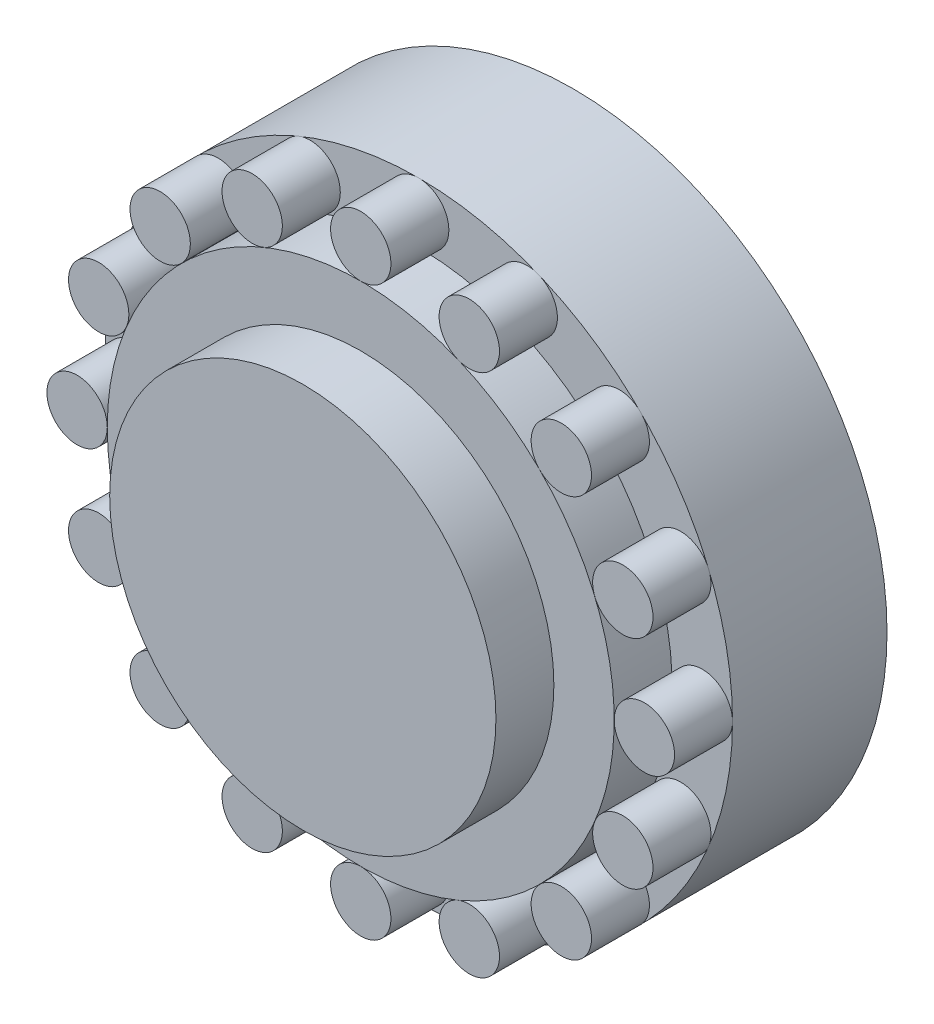
ISO-10303-21;
HEADER;
FILE_DESCRIPTION(('STEP AP214'),'2;1');
FILE_NAME('part.step','',(''),(''),'','','');
FILE_SCHEMA(('AUTOMOTIVE_DESIGN { 1 0 10303 214 1 1 1 1 }'));
ENDSEC;
DATA;
#1=APPLICATION_CONTEXT('core data for automotive mechanical design processes');
#2=APPLICATION_PROTOCOL_DEFINITION('international standard','automotive_design',2000,#1);
#3=PRODUCT_CONTEXT('',#1,'mechanical');
#4=PRODUCT('Part','Part','',(#3));
#5=PRODUCT_RELATED_PRODUCT_CATEGORY('part','',(#4));
#6=PRODUCT_DEFINITION_FORMATION('','',#4);
#7=PRODUCT_DEFINITION_CONTEXT('part definition',#1,'design');
#8=PRODUCT_DEFINITION('design','',#6,#7);
#9=PRODUCT_DEFINITION_SHAPE('','',#8);
#10=(LENGTH_UNIT() NAMED_UNIT(*) SI_UNIT(.MILLI.,.METRE.));
#11=(NAMED_UNIT(*) PLANE_ANGLE_UNIT() SI_UNIT($,.RADIAN.));
#12=(NAMED_UNIT(*) SI_UNIT($,.STERADIAN.) SOLID_ANGLE_UNIT());
#13=UNCERTAINTY_MEASURE_WITH_UNIT(LENGTH_MEASURE(1.E-05),#10,'distance_accuracy_value','');
#14=(GEOMETRIC_REPRESENTATION_CONTEXT(3) GLOBAL_UNCERTAINTY_ASSIGNED_CONTEXT((#13)) GLOBAL_UNIT_ASSIGNED_CONTEXT((#10,
#11,#12)) REPRESENTATION_CONTEXT('',''));
#15=CARTESIAN_POINT('',(0.,0.,0.));
#16=DIRECTION('',(0.,0.,1.));
#17=DIRECTION('',(1.,0.,0.));
#18=AXIS2_PLACEMENT_3D('',#15,#16,#17);
#19=CARTESIAN_POINT('',(-27.1389612677034,-11.2412217614125,22.));
#20=DIRECTION('',(0.,0.,-1.));
#21=DIRECTION('',(-1.,0.,0.));
#22=AXIS2_PLACEMENT_3D('',#19,#20,#21);
#23=CYLINDRICAL_SURFACE('',#22,3.125);
#24=CARTESIAN_POINT('',(-27.1389612677034,-11.2412217614125,22.));
#25=DIRECTION('',(0.,0.,1.));
#26=DIRECTION('',(1.,0.,0.));
#27=AXIS2_PLACEMENT_3D('',#24,#25,#26);
#28=CIRCLE('',#27,3.125);
#29=CARTESIAN_POINT('',(-24.0139612677034,-11.2412217614125,22.));
#30=VERTEX_POINT('',#29);
#31=EDGE_CURVE('E11',#30,#30,#28,.T.);
#32=ORIENTED_EDGE('',*,*,#31,.F.);
#33=EDGE_LOOP('',(#32));
#34=FACE_BOUND('',#33,.T.);
#35=CARTESIAN_POINT('',(-27.1389612677034,-11.2412217614125,16.));
#36=DIRECTION('',(0.,0.,1.));
#37=DIRECTION('',(1.,0.,0.));
#38=AXIS2_PLACEMENT_3D('',#35,#36,#37);
#39=CIRCLE('',#38,3.125);
#40=CARTESIAN_POINT('',(-24.0139612677034,-11.2412217614125,16.));
#41=VERTEX_POINT('',#40);
#42=EDGE_CURVE('E44',#41,#41,#39,.T.);
#43=ORIENTED_EDGE('',*,*,#42,.T.);
#44=EDGE_LOOP('',(#43));
#45=FACE_BOUND('',#44,.T.);
#46=ADVANCED_FACE('F41',(#34,#45),#23,.T.);
#47=CARTESIAN_POINT('',(-27.1389612677034,-11.2412217614125,22.));
#48=DIRECTION('',(0.,0.,1.));
#49=DIRECTION('',(1.,0.,0.));
#50=AXIS2_PLACEMENT_3D('',#47,#48,#49);
#51=PLANE('',#50);
#52=ORIENTED_EDGE('',*,*,#31,.T.);
#53=EDGE_LOOP('',(#52));
#54=FACE_BOUND('',#53,.T.);
#55=ADVANCED_FACE('F56',(#54),#51,.T.);
#56=CARTESIAN_POINT('',(-27.1389612677034,-11.2412217614125,16.));
#57=DIRECTION('',(0.,0.,1.));
#58=DIRECTION('',(1.,0.,0.));
#59=AXIS2_PLACEMENT_3D('',#56,#57,#58);
#60=PLANE('',#59);
#61=ORIENTED_EDGE('',*,*,#42,.F.);
#62=EDGE_LOOP('',(#61));
#63=FACE_BOUND('',#62,.T.);
#64=ADVANCED_FACE('F54',(#63),#60,.F.);
#65=CLOSED_SHELL('',(#46,#55,#64));
#66=MANIFOLD_SOLID_BREP('B2',#65);
#67=CARTESIAN_POINT('',(-20.7713015213976,-20.7710614902253,22.));
#68=DIRECTION('',(0.,0.,-1.));
#69=DIRECTION('',(-1.,0.,0.));
#70=AXIS2_PLACEMENT_3D('',#67,#68,#69);
#71=CYLINDRICAL_SURFACE('',#70,3.125);
#72=CARTESIAN_POINT('',(-20.7713015213976,-20.7710614902253,22.));
#73=DIRECTION('',(0.,0.,1.));
#74=DIRECTION('',(1.,0.,0.));
#75=AXIS2_PLACEMENT_3D('',#72,#73,#74);
#76=CIRCLE('',#75,3.125);
#77=CARTESIAN_POINT('',(-17.6463015213976,-20.7710614902253,22.));
#78=VERTEX_POINT('',#77);
#79=EDGE_CURVE('E40',#78,#78,#76,.T.);
#80=ORIENTED_EDGE('',*,*,#79,.F.);
#81=EDGE_LOOP('',(#80));
#82=FACE_BOUND('',#81,.T.);
#83=CARTESIAN_POINT('',(-20.7713015213976,-20.7710614902253,16.));
#84=DIRECTION('',(0.,0.,1.));
#85=DIRECTION('',(1.,0.,0.));
#86=AXIS2_PLACEMENT_3D('',#83,#84,#85);
#87=CIRCLE('',#86,3.125);
#88=CARTESIAN_POINT('',(-17.6463015213976,-20.7710614902253,16.));
#89=VERTEX_POINT('',#88);
#90=EDGE_CURVE('E92',#89,#89,#87,.T.);
#91=ORIENTED_EDGE('',*,*,#90,.T.);
#92=EDGE_LOOP('',(#91));
#93=FACE_BOUND('',#92,.T.);
#94=ADVANCED_FACE('F89',(#82,#93),#71,.T.);
#95=CARTESIAN_POINT('',(-20.7713015213976,-20.7710614902253,22.));
#96=DIRECTION('',(0.,0.,1.));
#97=DIRECTION('',(1.,0.,0.));
#98=AXIS2_PLACEMENT_3D('',#95,#96,#97);
#99=PLANE('',#98);
#100=ORIENTED_EDGE('',*,*,#79,.T.);
#101=EDGE_LOOP('',(#100));
#102=FACE_BOUND('',#101,.T.);
#103=ADVANCED_FACE('F104',(#102),#99,.T.);
#104=CARTESIAN_POINT('',(-20.7713015213976,-20.7710614902253,16.));
#105=DIRECTION('',(0.,0.,1.));
#106=DIRECTION('',(1.,0.,0.));
#107=AXIS2_PLACEMENT_3D('',#104,#105,#106);
#108=PLANE('',#107);
#109=ORIENTED_EDGE('',*,*,#90,.F.);
#110=EDGE_LOOP('',(#109));
#111=FACE_BOUND('',#110,.T.);
#112=ADVANCED_FACE('F102',(#111),#108,.F.);
#113=CLOSED_SHELL('',(#94,#103,#112));
#114=MANIFOLD_SOLID_BREP('B6',#113);
#115=CARTESIAN_POINT('',(-11.2414392344783,-27.1386874759392,22.));
#116=DIRECTION('',(0.,0.,-1.));
#117=DIRECTION('',(-1.,0.,0.));
#118=AXIS2_PLACEMENT_3D('',#115,#116,#117);
#119=CYLINDRICAL_SURFACE('',#118,3.125);
#120=CARTESIAN_POINT('',(-11.2414392344783,-27.1386874759392,22.));
#121=DIRECTION('',(0.,0.,1.));
#122=DIRECTION('',(1.,0.,0.));
#123=AXIS2_PLACEMENT_3D('',#120,#121,#122);
#124=CIRCLE('',#123,3.125);
#125=CARTESIAN_POINT('',(-8.11643923447834,-27.1386874759392,22.));
#126=VERTEX_POINT('',#125);
#127=EDGE_CURVE('E88',#126,#126,#124,.T.);
#128=ORIENTED_EDGE('',*,*,#127,.F.);
#129=EDGE_LOOP('',(#128));
#130=FACE_BOUND('',#129,.T.);
#131=CARTESIAN_POINT('',(-11.2414392344783,-27.1386874759392,16.));
#132=DIRECTION('',(0.,0.,1.));
#133=DIRECTION('',(1.,0.,0.));
#134=AXIS2_PLACEMENT_3D('',#131,#132,#133);
#135=CIRCLE('',#134,3.125);
#136=CARTESIAN_POINT('',(-8.11643923447834,-27.1386874759392,16.));
#137=VERTEX_POINT('',#136);
#138=EDGE_CURVE('E140',#137,#137,#135,.T.);
#139=ORIENTED_EDGE('',*,*,#138,.T.);
#140=EDGE_LOOP('',(#139));
#141=FACE_BOUND('',#140,.T.);
#142=ADVANCED_FACE('F137',(#130,#141),#119,.T.);
#143=CARTESIAN_POINT('',(-11.2414392344783,-27.1386874759392,22.));
#144=DIRECTION('',(0.,0.,1.));
#145=DIRECTION('',(1.,0.,0.));
#146=AXIS2_PLACEMENT_3D('',#143,#144,#145);
#147=PLANE('',#146);
#148=ORIENTED_EDGE('',*,*,#127,.T.);
#149=EDGE_LOOP('',(#148));
#150=FACE_BOUND('',#149,.T.);
#151=ADVANCED_FACE('F152',(#150),#147,.T.);
#152=CARTESIAN_POINT('',(-11.2414392344783,-27.1386874759392,16.));
#153=DIRECTION('',(0.,0.,1.));
#154=DIRECTION('',(1.,0.,0.));
#155=AXIS2_PLACEMENT_3D('',#152,#153,#154);
#156=PLANE('',#155);
#157=ORIENTED_EDGE('',*,*,#138,.F.);
#158=EDGE_LOOP('',(#157));
#159=FACE_BOUND('',#158,.T.);
#160=ADVANCED_FACE('F150',(#159),#156,.F.);
#161=CLOSED_SHELL('',(#142,#151,#160));
#162=MANIFOLD_SOLID_BREP('B35',#161);
#163=CARTESIAN_POINT('',(-0.000209551712327896,-29.3746863849023,22.));
#164=DIRECTION('',(0.,0.,-1.));
#165=DIRECTION('',(-1.,0.,0.));
#166=AXIS2_PLACEMENT_3D('',#163,#164,#165);
#167=CYLINDRICAL_SURFACE('',#166,3.125);
#168=CARTESIAN_POINT('',(-0.000209551712327896,-29.3746863849023,22.));
#169=DIRECTION('',(0.,0.,1.));
#170=DIRECTION('',(1.,0.,0.));
#171=AXIS2_PLACEMENT_3D('',#168,#169,#170);
#172=CIRCLE('',#171,3.125);
#173=CARTESIAN_POINT('',(3.12479044828767,-29.3746863849023,22.));
#174=VERTEX_POINT('',#173);
#175=EDGE_CURVE('E136',#174,#174,#172,.T.);
#176=ORIENTED_EDGE('',*,*,#175,.F.);
#177=EDGE_LOOP('',(#176));
#178=FACE_BOUND('',#177,.T.);
#179=CARTESIAN_POINT('',(-0.000209551712327896,-29.3746863849023,16.));
#180=DIRECTION('',(0.,0.,1.));
#181=DIRECTION('',(1.,0.,0.));
#182=AXIS2_PLACEMENT_3D('',#179,#180,#181);
#183=CIRCLE('',#182,3.125);
#184=CARTESIAN_POINT('',(3.12479044828767,-29.3746863849023,16.));
#185=VERTEX_POINT('',#184);
#186=EDGE_CURVE('E188',#185,#185,#183,.T.);
#187=ORIENTED_EDGE('',*,*,#186,.T.);
#188=EDGE_LOOP('',(#187));
#189=FACE_BOUND('',#188,.T.);
#190=ADVANCED_FACE('F185',(#178,#189),#167,.T.);
#191=CARTESIAN_POINT('',(-0.000209551712327896,-29.3746863849023,22.));
#192=DIRECTION('',(0.,0.,1.));
#193=DIRECTION('',(1.,0.,0.));
#194=AXIS2_PLACEMENT_3D('',#191,#192,#193);
#195=PLANE('',#194);
#196=ORIENTED_EDGE('',*,*,#175,.T.);
#197=EDGE_LOOP('',(#196));
#198=FACE_BOUND('',#197,.T.);
#199=ADVANCED_FACE('F200',(#198),#195,.T.);
#200=CARTESIAN_POINT('',(-0.000209551712327896,-29.3746863849023,16.));
#201=DIRECTION('',(0.,0.,1.));
#202=DIRECTION('',(1.,0.,0.));
#203=AXIS2_PLACEMENT_3D('',#200,#201,#202);
#204=PLANE('',#203);
#205=ORIENTED_EDGE('',*,*,#186,.F.);
#206=EDGE_LOOP('',(#205));
#207=FACE_BOUND('',#206,.T.);
#208=ADVANCED_FACE('F198',(#207),#204,.F.);
#209=CLOSED_SHELL('',(#190,#199,#208));
#210=MANIFOLD_SOLID_BREP('B83',#209);
#211=CARTESIAN_POINT('',(11.2410122097001,-27.1386476526057,22.));
#212=DIRECTION('',(0.,0.,-1.));
#213=DIRECTION('',(-1.,0.,0.));
#214=AXIS2_PLACEMENT_3D('',#211,#212,#213);
#215=CYLINDRICAL_SURFACE('',#214,3.125);
#216=CARTESIAN_POINT('',(11.2410122097001,-27.1386476526057,22.));
#217=DIRECTION('',(0.,0.,1.));
#218=DIRECTION('',(1.,0.,0.));
#219=AXIS2_PLACEMENT_3D('',#216,#217,#218);
#220=CIRCLE('',#219,3.125);
#221=CARTESIAN_POINT('',(14.3660122097001,-27.1386476526057,22.));
#222=VERTEX_POINT('',#221);
#223=EDGE_CURVE('E184',#222,#222,#220,.T.);
#224=ORIENTED_EDGE('',*,*,#223,.F.);
#225=EDGE_LOOP('',(#224));
#226=FACE_BOUND('',#225,.T.);
#227=CARTESIAN_POINT('',(11.2410122097001,-27.1386476526057,16.));
#228=DIRECTION('',(0.,0.,1.));
#229=DIRECTION('',(1.,0.,0.));
#230=AXIS2_PLACEMENT_3D('',#227,#228,#229);
#231=CIRCLE('',#230,3.125);
#232=CARTESIAN_POINT('',(14.3660122097001,-27.1386476526057,16.));
#233=VERTEX_POINT('',#232);
#234=EDGE_CURVE('E236',#233,#233,#231,.T.);
#235=ORIENTED_EDGE('',*,*,#234,.T.);
#236=EDGE_LOOP('',(#235));
#237=FACE_BOUND('',#236,.T.);
#238=ADVANCED_FACE('F233',(#226,#237),#215,.T.);
#239=CARTESIAN_POINT('',(11.2410122097001,-27.1386476526057,22.));
#240=DIRECTION('',(0.,0.,1.));
#241=DIRECTION('',(1.,0.,0.));
#242=AXIS2_PLACEMENT_3D('',#239,#240,#241);
#243=PLANE('',#242);
#244=ORIENTED_EDGE('',*,*,#223,.T.);
#245=EDGE_LOOP('',(#244));
#246=FACE_BOUND('',#245,.T.);
#247=ADVANCED_FACE('F248',(#246),#243,.T.);
#248=CARTESIAN_POINT('',(11.2410122097001,-27.1386476526057,16.));
#249=DIRECTION('',(0.,0.,1.));
#250=DIRECTION('',(1.,0.,0.));
#251=AXIS2_PLACEMENT_3D('',#248,#249,#250);
#252=PLANE('',#251);
#253=ORIENTED_EDGE('',*,*,#234,.F.);
#254=EDGE_LOOP('',(#253));
#255=FACE_BOUND('',#254,.T.);
#256=ADVANCED_FACE('F246',(#255),#252,.F.);
#257=CLOSED_SHELL('',(#238,#247,#256));
#258=MANIFOLD_SOLID_BREP('B131',#257);
#259=CARTESIAN_POINT('',(20.770851938513,-20.7709879062999,22.));
#260=DIRECTION('',(0.,0.,-1.));
#261=DIRECTION('',(-1.,0.,0.));
#262=AXIS2_PLACEMENT_3D('',#259,#260,#261);
#263=CYLINDRICAL_SURFACE('',#262,3.125);
#264=CARTESIAN_POINT('',(20.770851938513,-20.7709879062999,22.));
#265=DIRECTION('',(0.,0.,1.));
#266=DIRECTION('',(1.,0.,0.));
#267=AXIS2_PLACEMENT_3D('',#264,#265,#266);
#268=CIRCLE('',#267,3.125);
#269=CARTESIAN_POINT('',(23.895851938513,-20.7709879062999,22.));
#270=VERTEX_POINT('',#269);
#271=EDGE_CURVE('E232',#270,#270,#268,.T.);
#272=ORIENTED_EDGE('',*,*,#271,.F.);
#273=EDGE_LOOP('',(#272));
#274=FACE_BOUND('',#273,.T.);
#275=CARTESIAN_POINT('',(20.770851938513,-20.7709879062999,16.));
#276=DIRECTION('',(0.,0.,1.));
#277=DIRECTION('',(1.,0.,0.));
#278=AXIS2_PLACEMENT_3D('',#275,#276,#277);
#279=CIRCLE('',#278,3.125);
#280=CARTESIAN_POINT('',(23.895851938513,-20.7709879062999,16.));
#281=VERTEX_POINT('',#280);
#282=EDGE_CURVE('E284',#281,#281,#279,.T.);
#283=ORIENTED_EDGE('',*,*,#282,.T.);
#284=EDGE_LOOP('',(#283));
#285=FACE_BOUND('',#284,.T.);
#286=ADVANCED_FACE('F281',(#274,#285),#263,.T.);
#287=CARTESIAN_POINT('',(20.770851938513,-20.7709879062999,22.));
#288=DIRECTION('',(0.,0.,1.));
#289=DIRECTION('',(1.,0.,0.));
#290=AXIS2_PLACEMENT_3D('',#287,#288,#289);
#291=PLANE('',#290);
#292=ORIENTED_EDGE('',*,*,#271,.T.);
#293=EDGE_LOOP('',(#292));
#294=FACE_BOUND('',#293,.T.);
#295=ADVANCED_FACE('F296',(#294),#291,.T.);
#296=CARTESIAN_POINT('',(20.770851938513,-20.7709879062999,16.));
#297=DIRECTION('',(0.,0.,1.));
#298=DIRECTION('',(1.,0.,0.));
#299=AXIS2_PLACEMENT_3D('',#296,#297,#298);
#300=PLANE('',#299);
#301=ORIENTED_EDGE('',*,*,#282,.F.);
#302=EDGE_LOOP('',(#301));
#303=FACE_BOUND('',#302,.T.);
#304=ADVANCED_FACE('F294',(#303),#300,.F.);
#305=CLOSED_SHELL('',(#286,#295,#304));
#306=MANIFOLD_SOLID_BREP('B179',#305);
#307=CARTESIAN_POINT('',(27.1384779242268,-11.2411256193806,22.));
#308=DIRECTION('',(0.,0.,-1.));
#309=DIRECTION('',(-1.,0.,0.));
#310=AXIS2_PLACEMENT_3D('',#307,#308,#309);
#311=CYLINDRICAL_SURFACE('',#310,3.125);
#312=CARTESIAN_POINT('',(27.1384779242268,-11.2411256193806,22.));
#313=DIRECTION('',(0.,0.,1.));
#314=DIRECTION('',(1.,0.,0.));
#315=AXIS2_PLACEMENT_3D('',#312,#313,#314);
#316=CIRCLE('',#315,3.125);
#317=CARTESIAN_POINT('',(30.2634779242268,-11.2411256193806,22.));
#318=VERTEX_POINT('',#317);
#319=EDGE_CURVE('E280',#318,#318,#316,.T.);
#320=ORIENTED_EDGE('',*,*,#319,.F.);
#321=EDGE_LOOP('',(#320));
#322=FACE_BOUND('',#321,.T.);
#323=CARTESIAN_POINT('',(27.1384779242268,-11.2411256193806,16.));
#324=DIRECTION('',(0.,0.,1.));
#325=DIRECTION('',(1.,0.,0.));
#326=AXIS2_PLACEMENT_3D('',#323,#324,#325);
#327=CIRCLE('',#326,3.125);
#328=CARTESIAN_POINT('',(30.2634779242268,-11.2411256193806,16.));
#329=VERTEX_POINT('',#328);
#330=EDGE_CURVE('E332',#329,#329,#327,.T.);
#331=ORIENTED_EDGE('',*,*,#330,.T.);
#332=EDGE_LOOP('',(#331));
#333=FACE_BOUND('',#332,.T.);
#334=ADVANCED_FACE('F329',(#322,#333),#311,.T.);
#335=CARTESIAN_POINT('',(27.1384779242268,-11.2411256193806,22.));
#336=DIRECTION('',(0.,0.,1.));
#337=DIRECTION('',(1.,0.,0.));
#338=AXIS2_PLACEMENT_3D('',#335,#336,#337);
#339=PLANE('',#338);
#340=ORIENTED_EDGE('',*,*,#319,.T.);
#341=EDGE_LOOP('',(#340));
#342=FACE_BOUND('',#341,.T.);
#343=ADVANCED_FACE('F344',(#342),#339,.T.);
#344=CARTESIAN_POINT('',(27.1384779242268,-11.2411256193806,16.));
#345=DIRECTION('',(0.,0.,1.));
#346=DIRECTION('',(1.,0.,0.));
#347=AXIS2_PLACEMENT_3D('',#344,#345,#346);
#348=PLANE('',#347);
#349=ORIENTED_EDGE('',*,*,#330,.F.);
#350=EDGE_LOOP('',(#349));
#351=FACE_BOUND('',#350,.T.);
#352=ADVANCED_FACE('F342',(#351),#348,.F.);
#353=CLOSED_SHELL('',(#334,#343,#352));
#354=MANIFOLD_SOLID_BREP('B227',#353);
#355=CARTESIAN_POINT('',(29.37447683319,0.000104063385373612,22.));
#356=DIRECTION('',(0.,0.,-1.));
#357=DIRECTION('',(-1.,0.,0.));
#358=AXIS2_PLACEMENT_3D('',#355,#356,#357);
#359=CYLINDRICAL_SURFACE('',#358,3.12499999999999);
#360=CARTESIAN_POINT('',(29.37447683319,0.000104063385373612,22.));
#361=DIRECTION('',(0.,0.,1.));
#362=DIRECTION('',(1.,0.,0.));
#363=AXIS2_PLACEMENT_3D('',#360,#361,#362);
#364=CIRCLE('',#363,3.12499999999999);
#365=CARTESIAN_POINT('',(32.49947683319,0.000104063385373612,22.));
#366=VERTEX_POINT('',#365);
#367=EDGE_CURVE('E328',#366,#366,#364,.T.);
#368=ORIENTED_EDGE('',*,*,#367,.F.);
#369=EDGE_LOOP('',(#368));
#370=FACE_BOUND('',#369,.T.);
#371=CARTESIAN_POINT('',(29.37447683319,0.000104063385373612,16.));
#372=DIRECTION('',(0.,0.,1.));
#373=DIRECTION('',(1.,0.,0.));
#374=AXIS2_PLACEMENT_3D('',#371,#372,#373);
#375=CIRCLE('',#374,3.12499999999999);
#376=CARTESIAN_POINT('',(32.49947683319,0.000104063385373612,16.));
#377=VERTEX_POINT('',#376);
#378=EDGE_CURVE('E380',#377,#377,#375,.T.);
#379=ORIENTED_EDGE('',*,*,#378,.T.);
#380=EDGE_LOOP('',(#379));
#381=FACE_BOUND('',#380,.T.);
#382=ADVANCED_FACE('F377',(#370,#381),#359,.T.);
#383=CARTESIAN_POINT('',(29.37447683319,0.000104063385373612,22.));
#384=DIRECTION('',(0.,0.,1.));
#385=DIRECTION('',(1.,0.,0.));
#386=AXIS2_PLACEMENT_3D('',#383,#384,#385);
#387=PLANE('',#386);
#388=ORIENTED_EDGE('',*,*,#367,.T.);
#389=EDGE_LOOP('',(#388));
#390=FACE_BOUND('',#389,.T.);
#391=ADVANCED_FACE('F392',(#390),#387,.T.);
#392=CARTESIAN_POINT('',(29.37447683319,0.000104063385373612,16.));
#393=DIRECTION('',(0.,0.,1.));
#394=DIRECTION('',(1.,0.,0.));
#395=AXIS2_PLACEMENT_3D('',#392,#393,#394);
#396=PLANE('',#395);
#397=ORIENTED_EDGE('',*,*,#378,.F.);
#398=EDGE_LOOP('',(#397));
#399=FACE_BOUND('',#398,.T.);
#400=ADVANCED_FACE('F390',(#399),#396,.F.);
#401=CLOSED_SHELL('',(#382,#391,#400));
#402=MANIFOLD_SOLID_BREP('B275',#401);
#403=CARTESIAN_POINT('',(27.1384381008933,11.2413258247978,22.));
#404=DIRECTION('',(0.,0.,-1.));
#405=DIRECTION('',(-1.,0.,0.));
#406=AXIS2_PLACEMENT_3D('',#403,#404,#405);
#407=CYLINDRICAL_SURFACE('',#406,3.125);
#408=CARTESIAN_POINT('',(27.1384381008933,11.2413258247978,22.));
#409=DIRECTION('',(0.,0.,1.));
#410=DIRECTION('',(1.,0.,0.));
#411=AXIS2_PLACEMENT_3D('',#408,#409,#410);
#412=CIRCLE('',#411,3.125);
#413=CARTESIAN_POINT('',(30.2634381008933,11.2413258247978,22.));
#414=VERTEX_POINT('',#413);
#415=EDGE_CURVE('E376',#414,#414,#412,.T.);
#416=ORIENTED_EDGE('',*,*,#415,.F.);
#417=EDGE_LOOP('',(#416));
#418=FACE_BOUND('',#417,.T.);
#419=CARTESIAN_POINT('',(27.1384381008933,11.2413258247978,16.));
#420=DIRECTION('',(0.,0.,1.));
#421=DIRECTION('',(1.,0.,0.));
#422=AXIS2_PLACEMENT_3D('',#419,#420,#421);
#423=CIRCLE('',#422,3.125);
#424=CARTESIAN_POINT('',(30.2634381008933,11.2413258247978,16.));
#425=VERTEX_POINT('',#424);
#426=EDGE_CURVE('E428',#425,#425,#423,.T.);
#427=ORIENTED_EDGE('',*,*,#426,.T.);
#428=EDGE_LOOP('',(#427));
#429=FACE_BOUND('',#428,.T.);
#430=ADVANCED_FACE('F425',(#418,#429),#407,.T.);
#431=CARTESIAN_POINT('',(27.1384381008933,11.2413258247978,22.));
#432=DIRECTION('',(0.,0.,1.));
#433=DIRECTION('',(1.,0.,0.));
#434=AXIS2_PLACEMENT_3D('',#431,#432,#433);
#435=PLANE('',#434);
#436=ORIENTED_EDGE('',*,*,#415,.T.);
#437=EDGE_LOOP('',(#436));
#438=FACE_BOUND('',#437,.T.);
#439=ADVANCED_FACE('F440',(#438),#435,.T.);
#440=CARTESIAN_POINT('',(27.1384381008933,11.2413258247978,16.));
#441=DIRECTION('',(0.,0.,1.));
#442=DIRECTION('',(1.,0.,0.));
#443=AXIS2_PLACEMENT_3D('',#440,#441,#442);
#444=PLANE('',#443);
#445=ORIENTED_EDGE('',*,*,#426,.F.);
#446=EDGE_LOOP('',(#445));
#447=FACE_BOUND('',#446,.T.);
#448=ADVANCED_FACE('F438',(#447),#444,.F.);
#449=CLOSED_SHELL('',(#430,#439,#448));
#450=MANIFOLD_SOLID_BREP('B323',#449);
#451=CARTESIAN_POINT('',(20.7707783545875,20.7711655536107,22.));
#452=DIRECTION('',(0.,0.,-1.));
#453=DIRECTION('',(-1.,0.,0.));
#454=AXIS2_PLACEMENT_3D('',#451,#452,#453);
#455=CYLINDRICAL_SURFACE('',#454,3.125);
#456=CARTESIAN_POINT('',(20.7707783545875,20.7711655536107,22.));
#457=DIRECTION('',(0.,0.,1.));
#458=DIRECTION('',(1.,0.,0.));
#459=AXIS2_PLACEMENT_3D('',#456,#457,#458);
#460=CIRCLE('',#459,3.125);
#461=CARTESIAN_POINT('',(23.8957783545875,20.7711655536107,22.));
#462=VERTEX_POINT('',#461);
#463=EDGE_CURVE('E424',#462,#462,#460,.T.);
#464=ORIENTED_EDGE('',*,*,#463,.F.);
#465=EDGE_LOOP('',(#464));
#466=FACE_BOUND('',#465,.T.);
#467=CARTESIAN_POINT('',(20.7707783545875,20.7711655536107,16.));
#468=DIRECTION('',(0.,0.,1.));
#469=DIRECTION('',(1.,0.,0.));
#470=AXIS2_PLACEMENT_3D('',#467,#468,#469);
#471=CIRCLE('',#470,3.125);
#472=CARTESIAN_POINT('',(23.8957783545875,20.7711655536107,16.));
#473=VERTEX_POINT('',#472);
#474=EDGE_CURVE('E476',#473,#473,#471,.T.);
#475=ORIENTED_EDGE('',*,*,#474,.T.);
#476=EDGE_LOOP('',(#475));
#477=FACE_BOUND('',#476,.T.);
#478=ADVANCED_FACE('F473',(#466,#477),#455,.T.);
#479=CARTESIAN_POINT('',(20.7707783545875,20.7711655536107,22.));
#480=DIRECTION('',(0.,0.,1.));
#481=DIRECTION('',(1.,0.,0.));
#482=AXIS2_PLACEMENT_3D('',#479,#480,#481);
#483=PLANE('',#482);
#484=ORIENTED_EDGE('',*,*,#463,.T.);
#485=EDGE_LOOP('',(#484));
#486=FACE_BOUND('',#485,.T.);
#487=ADVANCED_FACE('F488',(#486),#483,.T.);
#488=CARTESIAN_POINT('',(20.7707783545875,20.7711655536107,16.));
#489=DIRECTION('',(0.,0.,1.));
#490=DIRECTION('',(1.,0.,0.));
#491=AXIS2_PLACEMENT_3D('',#488,#489,#490);
#492=PLANE('',#491);
#493=ORIENTED_EDGE('',*,*,#474,.F.);
#494=EDGE_LOOP('',(#493));
#495=FACE_BOUND('',#494,.T.);
#496=ADVANCED_FACE('F486',(#495),#492,.F.);
#497=CLOSED_SHELL('',(#478,#487,#496));
#498=MANIFOLD_SOLID_BREP('B371',#497);
#499=CARTESIAN_POINT('',(11.2409160676683,27.1387915393245,22.));
#500=DIRECTION('',(0.,0.,-1.));
#501=DIRECTION('',(-1.,0.,0.));
#502=AXIS2_PLACEMENT_3D('',#499,#500,#501);
#503=CYLINDRICAL_SURFACE('',#502,3.125);
#504=CARTESIAN_POINT('',(11.2409160676683,27.1387915393245,22.));
#505=DIRECTION('',(0.,0.,1.));
#506=DIRECTION('',(1.,0.,0.));
#507=AXIS2_PLACEMENT_3D('',#504,#505,#506);
#508=CIRCLE('',#507,3.125);
#509=CARTESIAN_POINT('',(14.3659160676683,27.1387915393245,22.));
#510=VERTEX_POINT('',#509);
#511=EDGE_CURVE('E472',#510,#510,#508,.T.);
#512=ORIENTED_EDGE('',*,*,#511,.F.);
#513=EDGE_LOOP('',(#512));
#514=FACE_BOUND('',#513,.T.);
#515=CARTESIAN_POINT('',(11.2409160676683,27.1387915393245,16.));
#516=DIRECTION('',(0.,0.,1.));
#517=DIRECTION('',(1.,0.,0.));
#518=AXIS2_PLACEMENT_3D('',#515,#516,#517);
#519=CIRCLE('',#518,3.125);
#520=CARTESIAN_POINT('',(14.3659160676683,27.1387915393245,16.));
#521=VERTEX_POINT('',#520);
#522=EDGE_CURVE('E524',#521,#521,#519,.T.);
#523=ORIENTED_EDGE('',*,*,#522,.T.);
#524=EDGE_LOOP('',(#523));
#525=FACE_BOUND('',#524,.T.);
#526=ADVANCED_FACE('F521',(#514,#525),#503,.T.);
#527=CARTESIAN_POINT('',(11.2409160676683,27.1387915393245,22.));
#528=DIRECTION('',(0.,0.,1.));
#529=DIRECTION('',(1.,0.,0.));
#530=AXIS2_PLACEMENT_3D('',#527,#528,#529);
#531=PLANE('',#530);
#532=ORIENTED_EDGE('',*,*,#511,.T.);
#533=EDGE_LOOP('',(#532));
#534=FACE_BOUND('',#533,.T.);
#535=ADVANCED_FACE('F536',(#534),#531,.T.);
#536=CARTESIAN_POINT('',(11.2409160676683,27.1387915393245,16.));
#537=DIRECTION('',(0.,0.,1.));
#538=DIRECTION('',(1.,0.,0.));
#539=AXIS2_PLACEMENT_3D('',#536,#537,#538);
#540=PLANE('',#539);
#541=ORIENTED_EDGE('',*,*,#522,.F.);
#542=EDGE_LOOP('',(#541));
#543=FACE_BOUND('',#542,.T.);
#544=ADVANCED_FACE('F534',(#543),#540,.F.);
#545=CLOSED_SHELL('',(#526,#535,#544));
#546=MANIFOLD_SOLID_BREP('B419',#545);
#547=CARTESIAN_POINT('',(-0.000313615097704889,29.3747904482877,22.));
#548=DIRECTION('',(0.,0.,-1.));
#549=DIRECTION('',(-1.,0.,0.));
#550=AXIS2_PLACEMENT_3D('',#547,#548,#549);
#551=CYLINDRICAL_SURFACE('',#550,3.125);
#552=CARTESIAN_POINT('',(-0.000313615097704889,29.3747904482877,22.));
#553=DIRECTION('',(0.,0.,1.));
#554=DIRECTION('',(1.,0.,0.));
#555=AXIS2_PLACEMENT_3D('',#552,#553,#554);
#556=CIRCLE('',#555,3.125);
#557=CARTESIAN_POINT('',(3.12468638490229,29.3747904482877,22.));
#558=VERTEX_POINT('',#557);
#559=EDGE_CURVE('E520',#558,#558,#556,.T.);
#560=ORIENTED_EDGE('',*,*,#559,.F.);
#561=EDGE_LOOP('',(#560));
#562=FACE_BOUND('',#561,.T.);
#563=CARTESIAN_POINT('',(-0.000313615097704889,29.3747904482877,16.));
#564=DIRECTION('',(0.,0.,1.));
#565=DIRECTION('',(1.,0.,0.));
#566=AXIS2_PLACEMENT_3D('',#563,#564,#565);
#567=CIRCLE('',#566,3.125);
#568=CARTESIAN_POINT('',(3.12468638490229,29.3747904482877,16.));
#569=VERTEX_POINT('',#568);
#570=EDGE_CURVE('E572',#569,#569,#567,.T.);
#571=ORIENTED_EDGE('',*,*,#570,.T.);
#572=EDGE_LOOP('',(#571));
#573=FACE_BOUND('',#572,.T.);
#574=ADVANCED_FACE('F569',(#562,#573),#551,.T.);
#575=CARTESIAN_POINT('',(-0.000313615097704889,29.3747904482877,22.));
#576=DIRECTION('',(0.,0.,1.));
#577=DIRECTION('',(1.,0.,0.));
#578=AXIS2_PLACEMENT_3D('',#575,#576,#577);
#579=PLANE('',#578);
#580=ORIENTED_EDGE('',*,*,#559,.T.);
#581=EDGE_LOOP('',(#580));
#582=FACE_BOUND('',#581,.T.);
#583=ADVANCED_FACE('F584',(#582),#579,.T.);
#584=CARTESIAN_POINT('',(-0.000313615097704889,29.3747904482877,16.));
#585=DIRECTION('',(0.,0.,1.));
#586=DIRECTION('',(1.,0.,0.));
#587=AXIS2_PLACEMENT_3D('',#584,#585,#586);
#588=PLANE('',#587);
#589=ORIENTED_EDGE('',*,*,#570,.F.);
#590=EDGE_LOOP('',(#589));
#591=FACE_BOUND('',#590,.T.);
#592=ADVANCED_FACE('F582',(#591),#588,.F.);
#593=CLOSED_SHELL('',(#574,#583,#592));
#594=MANIFOLD_SOLID_BREP('B467',#593);
#595=CARTESIAN_POINT('',(-11.2415353765102,27.138751715991,22.));
#596=DIRECTION('',(0.,0.,-1.));
#597=DIRECTION('',(-1.,0.,0.));
#598=AXIS2_PLACEMENT_3D('',#595,#596,#597);
#599=CYLINDRICAL_SURFACE('',#598,3.12499999999999);
#600=CARTESIAN_POINT('',(-11.2415353765102,27.138751715991,22.));
#601=DIRECTION('',(0.,0.,1.));
#602=DIRECTION('',(1.,0.,0.));
#603=AXIS2_PLACEMENT_3D('',#600,#601,#602);
#604=CIRCLE('',#603,3.12499999999999);
#605=CARTESIAN_POINT('',(-8.11653537651017,27.138751715991,22.));
#606=VERTEX_POINT('',#605);
#607=EDGE_CURVE('E568',#606,#606,#604,.T.);
#608=ORIENTED_EDGE('',*,*,#607,.F.);
#609=EDGE_LOOP('',(#608));
#610=FACE_BOUND('',#609,.T.);
#611=CARTESIAN_POINT('',(-11.2415353765102,27.138751715991,16.));
#612=DIRECTION('',(0.,0.,1.));
#613=DIRECTION('',(1.,0.,0.));
#614=AXIS2_PLACEMENT_3D('',#611,#612,#613);
#615=CIRCLE('',#614,3.12499999999999);
#616=CARTESIAN_POINT('',(-8.11653537651017,27.138751715991,16.));
#617=VERTEX_POINT('',#616);
#618=EDGE_CURVE('E620',#617,#617,#615,.T.);
#619=ORIENTED_EDGE('',*,*,#618,.T.);
#620=EDGE_LOOP('',(#619));
#621=FACE_BOUND('',#620,.T.);
#622=ADVANCED_FACE('F617',(#610,#621),#599,.T.);
#623=CARTESIAN_POINT('',(-11.2415353765102,27.138751715991,22.));
#624=DIRECTION('',(0.,0.,1.));
#625=DIRECTION('',(1.,0.,0.));
#626=AXIS2_PLACEMENT_3D('',#623,#624,#625);
#627=PLANE('',#626);
#628=ORIENTED_EDGE('',*,*,#607,.T.);
#629=EDGE_LOOP('',(#628));
#630=FACE_BOUND('',#629,.T.);
#631=ADVANCED_FACE('F632',(#630),#627,.T.);
#632=CARTESIAN_POINT('',(-11.2415353765102,27.138751715991,16.));
#633=DIRECTION('',(0.,0.,1.));
#634=DIRECTION('',(1.,0.,0.));
#635=AXIS2_PLACEMENT_3D('',#632,#633,#634);
#636=PLANE('',#635);
#637=ORIENTED_EDGE('',*,*,#618,.F.);
#638=EDGE_LOOP('',(#637));
#639=FACE_BOUND('',#638,.T.);
#640=ADVANCED_FACE('F630',(#639),#636,.F.);
#641=CLOSED_SHELL('',(#622,#631,#640));
#642=MANIFOLD_SOLID_BREP('B515',#641);
#643=CARTESIAN_POINT('',(-20.771375105323,20.7710919696852,22.));
#644=DIRECTION('',(0.,0.,-1.));
#645=DIRECTION('',(-1.,0.,0.));
#646=AXIS2_PLACEMENT_3D('',#643,#644,#645);
#647=CYLINDRICAL_SURFACE('',#646,3.125);
#648=CARTESIAN_POINT('',(-20.771375105323,20.7710919696852,22.));
#649=DIRECTION('',(0.,0.,1.));
#650=DIRECTION('',(1.,0.,0.));
#651=AXIS2_PLACEMENT_3D('',#648,#649,#650);
#652=CIRCLE('',#651,3.125);
#653=CARTESIAN_POINT('',(-17.6463751053231,20.7710919696852,22.));
#654=VERTEX_POINT('',#653);
#655=EDGE_CURVE('E616',#654,#654,#652,.T.);
#656=ORIENTED_EDGE('',*,*,#655,.F.);
#657=EDGE_LOOP('',(#656));
#658=FACE_BOUND('',#657,.T.);
#659=CARTESIAN_POINT('',(-20.771375105323,20.7710919696852,16.));
#660=DIRECTION('',(0.,0.,1.));
#661=DIRECTION('',(1.,0.,0.));
#662=AXIS2_PLACEMENT_3D('',#659,#660,#661);
#663=CIRCLE('',#662,3.125);
#664=CARTESIAN_POINT('',(-17.6463751053231,20.7710919696852,16.));
#665=VERTEX_POINT('',#664);
#666=EDGE_CURVE('E668',#665,#665,#663,.T.);
#667=ORIENTED_EDGE('',*,*,#666,.T.);
#668=EDGE_LOOP('',(#667));
#669=FACE_BOUND('',#668,.T.);
#670=ADVANCED_FACE('F665',(#658,#669),#647,.T.);
#671=CARTESIAN_POINT('',(-20.771375105323,20.7710919696852,22.));
#672=DIRECTION('',(0.,0.,1.));
#673=DIRECTION('',(1.,0.,0.));
#674=AXIS2_PLACEMENT_3D('',#671,#672,#673);
#675=PLANE('',#674);
#676=ORIENTED_EDGE('',*,*,#655,.T.);
#677=EDGE_LOOP('',(#676));
#678=FACE_BOUND('',#677,.T.);
#679=ADVANCED_FACE('F680',(#678),#675,.T.);
#680=CARTESIAN_POINT('',(-20.771375105323,20.7710919696852,16.));
#681=DIRECTION('',(0.,0.,1.));
#682=DIRECTION('',(1.,0.,0.));
#683=AXIS2_PLACEMENT_3D('',#680,#681,#682);
#684=PLANE('',#683);
#685=ORIENTED_EDGE('',*,*,#666,.F.);
#686=EDGE_LOOP('',(#685));
#687=FACE_BOUND('',#686,.T.);
#688=ADVANCED_FACE('F678',(#687),#684,.F.);
#689=CLOSED_SHELL('',(#670,#679,#688));
#690=MANIFOLD_SOLID_BREP('B563',#689);
#691=CARTESIAN_POINT('',(-27.1390010910369,11.241229682766,22.));
#692=DIRECTION('',(0.,0.,-1.));
#693=DIRECTION('',(-1.,0.,0.));
#694=AXIS2_PLACEMENT_3D('',#691,#692,#693);
#695=CYLINDRICAL_SURFACE('',#694,3.125);
#696=CARTESIAN_POINT('',(-27.1390010910369,11.241229682766,22.));
#697=DIRECTION('',(0.,0.,1.));
#698=DIRECTION('',(1.,0.,0.));
#699=AXIS2_PLACEMENT_3D('',#696,#697,#698);
#700=CIRCLE('',#699,3.125);
#701=CARTESIAN_POINT('',(-24.0140010910369,11.241229682766,22.));
#702=VERTEX_POINT('',#701);
#703=EDGE_CURVE('E664',#702,#702,#700,.T.);
#704=ORIENTED_EDGE('',*,*,#703,.F.);
#705=EDGE_LOOP('',(#704));
#706=FACE_BOUND('',#705,.T.);
#707=CARTESIAN_POINT('',(-27.1390010910369,11.241229682766,16.));
#708=DIRECTION('',(0.,0.,1.));
#709=DIRECTION('',(1.,0.,0.));
#710=AXIS2_PLACEMENT_3D('',#707,#708,#709);
#711=CIRCLE('',#710,3.125);
#712=CARTESIAN_POINT('',(-24.0140010910369,11.241229682766,16.));
#713=VERTEX_POINT('',#712);
#714=EDGE_CURVE('E716',#713,#713,#711,.T.);
#715=ORIENTED_EDGE('',*,*,#714,.T.);
#716=EDGE_LOOP('',(#715));
#717=FACE_BOUND('',#716,.T.);
#718=ADVANCED_FACE('F713',(#706,#717),#695,.T.);
#719=CARTESIAN_POINT('',(-27.1390010910369,11.241229682766,22.));
#720=DIRECTION('',(0.,0.,1.));
#721=DIRECTION('',(1.,0.,0.));
#722=AXIS2_PLACEMENT_3D('',#719,#720,#721);
#723=PLANE('',#722);
#724=ORIENTED_EDGE('',*,*,#703,.T.);
#725=EDGE_LOOP('',(#724));
#726=FACE_BOUND('',#725,.T.);
#727=ADVANCED_FACE('F728',(#726),#723,.T.);
#728=CARTESIAN_POINT('',(-27.1390010910369,11.241229682766,16.));
#729=DIRECTION('',(0.,0.,1.));
#730=DIRECTION('',(1.,0.,0.));
#731=AXIS2_PLACEMENT_3D('',#728,#729,#730);
#732=PLANE('',#731);
#733=ORIENTED_EDGE('',*,*,#714,.F.);
#734=EDGE_LOOP('',(#733));
#735=FACE_BOUND('',#734,.T.);
#736=ADVANCED_FACE('F726',(#735),#732,.F.);
#737=CLOSED_SHELL('',(#718,#727,#736));
#738=MANIFOLD_SOLID_BREP('B611',#737);
#739=CARTESIAN_POINT('',(-29.375,0.,22.));
#740=DIRECTION('',(0.,0.,-1.));
#741=DIRECTION('',(-1.,0.,0.));
#742=AXIS2_PLACEMENT_3D('',#739,#740,#741);
#743=CYLINDRICAL_SURFACE('',#742,3.125);
#744=CARTESIAN_POINT('',(-29.375,0.,22.));
#745=DIRECTION('',(0.,0.,1.));
#746=DIRECTION('',(1.,0.,0.));
#747=AXIS2_PLACEMENT_3D('',#744,#745,#746);
#748=CIRCLE('',#747,3.125);
#749=CARTESIAN_POINT('',(-26.25,0.,22.));
#750=VERTEX_POINT('',#749);
#751=EDGE_CURVE('E712',#750,#750,#748,.T.);
#752=ORIENTED_EDGE('',*,*,#751,.F.);
#753=EDGE_LOOP('',(#752));
#754=FACE_BOUND('',#753,.T.);
#755=CARTESIAN_POINT('',(-29.375,0.,16.));
#756=DIRECTION('',(0.,0.,1.));
#757=DIRECTION('',(1.,0.,0.));
#758=AXIS2_PLACEMENT_3D('',#755,#756,#757);
#759=CIRCLE('',#758,3.125);
#760=CARTESIAN_POINT('',(-26.25,0.,16.));
#761=VERTEX_POINT('',#760);
#762=EDGE_CURVE('E763',#761,#761,#759,.T.);
#763=ORIENTED_EDGE('',*,*,#762,.T.);
#764=EDGE_LOOP('',(#763));
#765=FACE_BOUND('',#764,.T.);
#766=ADVANCED_FACE('F760',(#754,#765),#743,.T.);
#767=CARTESIAN_POINT('',(-29.375,0.,22.));
#768=DIRECTION('',(0.,0.,1.));
#769=DIRECTION('',(1.,0.,0.));
#770=AXIS2_PLACEMENT_3D('',#767,#768,#769);
#771=PLANE('',#770);
#772=ORIENTED_EDGE('',*,*,#751,.T.);
#773=EDGE_LOOP('',(#772));
#774=FACE_BOUND('',#773,.T.);
#775=ADVANCED_FACE('F775',(#774),#771,.T.);
#776=CARTESIAN_POINT('',(-29.375,0.,16.));
#777=DIRECTION('',(0.,0.,1.));
#778=DIRECTION('',(1.,0.,0.));
#779=AXIS2_PLACEMENT_3D('',#776,#777,#778);
#780=PLANE('',#779);
#781=ORIENTED_EDGE('',*,*,#762,.F.);
#782=EDGE_LOOP('',(#781));
#783=FACE_BOUND('',#782,.T.);
#784=ADVANCED_FACE('F773',(#783),#780,.F.);
#785=CLOSED_SHELL('',(#766,#775,#784));
#786=MANIFOLD_SOLID_BREP('B659',#785);
#787=CARTESIAN_POINT('',(0.,0.,0.));
#788=DIRECTION('',(0.,0.,-1.));
#789=DIRECTION('',(-1.,0.,0.));
#790=AXIS2_PLACEMENT_3D('',#787,#788,#789);
#791=PLANE('',#790);
#792=CARTESIAN_POINT('',(0.,0.,0.));
#793=DIRECTION('',(0.,0.,-1.));
#794=DIRECTION('',(-1.,0.,0.));
#795=AXIS2_PLACEMENT_3D('',#792,#793,#794);
#796=CIRCLE('',#795,32.5);
#797=CARTESIAN_POINT('',(-32.5,0.,0.));
#798=VERTEX_POINT('',#797);
#799=EDGE_CURVE('E822',#798,#798,#796,.T.);
#800=ORIENTED_EDGE('',*,*,#799,.T.);
#801=EDGE_LOOP('',(#800));
#802=FACE_BOUND('',#801,.T.);
#803=ADVANCED_FACE('F800',(#802),#791,.T.);
#804=CARTESIAN_POINT('',(0.,0.,28.));
#805=DIRECTION('',(0.,0.,1.));
#806=DIRECTION('',(1.,0.,0.));
#807=AXIS2_PLACEMENT_3D('',#804,#805,#806);
#808=PLANE('',#807);
#809=CARTESIAN_POINT('',(0.,0.,28.));
#810=DIRECTION('',(0.,0.,-1.));
#811=DIRECTION('',(-1.,0.,0.));
#812=AXIS2_PLACEMENT_3D('',#809,#810,#811);
#813=CIRCLE('',#812,20.);
#814=CARTESIAN_POINT('',(-20.,0.,28.));
#815=VERTEX_POINT('',#814);
#816=EDGE_CURVE('E759',#815,#815,#813,.T.);
#817=ORIENTED_EDGE('',*,*,#816,.F.);
#818=EDGE_LOOP('',(#817));
#819=FACE_BOUND('',#818,.T.);
#820=ADVANCED_FACE('F839',(#819),#808,.T.);
#821=CARTESIAN_POINT('',(0.,0.,-26.831100571494));
#822=DIRECTION('',(0.,0.,-1.));
#823=DIRECTION('',(-1.,0.,0.));
#824=AXIS2_PLACEMENT_3D('',#821,#822,#823);
#825=CYLINDRICAL_SURFACE('',#824,20.);
#826=ORIENTED_EDGE('',*,*,#816,.T.);
#827=EDGE_LOOP('',(#826));
#828=FACE_BOUND('',#827,.T.);
#829=CARTESIAN_POINT('',(0.,0.,22.));
#830=DIRECTION('',(0.,0.,-1.));
#831=DIRECTION('',(-1.,0.,0.));
#832=AXIS2_PLACEMENT_3D('',#829,#830,#831);
#833=CIRCLE('',#832,20.);
#834=CARTESIAN_POINT('',(-20.,0.,22.));
#835=VERTEX_POINT('',#834);
#836=EDGE_CURVE('E806',#835,#835,#833,.T.);
#837=ORIENTED_EDGE('',*,*,#836,.F.);
#838=EDGE_LOOP('',(#837));
#839=FACE_BOUND('',#838,.T.);
#840=ADVANCED_FACE('F843',(#828,#839),#825,.T.);
#841=CARTESIAN_POINT('',(0.,0.,22.));
#842=DIRECTION('',(0.,0.,1.));
#843=DIRECTION('',(1.,0.,0.));
#844=AXIS2_PLACEMENT_3D('',#841,#842,#843);
#845=PLANE('',#844);
#846=ORIENTED_EDGE('',*,*,#836,.T.);
#847=EDGE_LOOP('',(#846));
#848=FACE_BOUND('',#847,.T.);
#849=CARTESIAN_POINT('',(0.,0.,22.));
#850=DIRECTION('',(0.,0.,-1.));
#851=DIRECTION('',(-1.,0.,0.));
#852=AXIS2_PLACEMENT_3D('',#849,#850,#851);
#853=CIRCLE('',#852,26.25);
#854=CARTESIAN_POINT('',(-26.25,0.,22.));
#855=VERTEX_POINT('',#854);
#856=EDGE_CURVE('E810',#855,#855,#853,.T.);
#857=ORIENTED_EDGE('',*,*,#856,.F.);
#858=EDGE_LOOP('',(#857));
#859=FACE_BOUND('',#858,.T.);
#860=ADVANCED_FACE('F848',(#848,#859),#845,.T.);
#861=CARTESIAN_POINT('',(0.,0.,-26.831100571494));
#862=DIRECTION('',(0.,0.,-1.));
#863=DIRECTION('',(-1.,0.,0.));
#864=AXIS2_PLACEMENT_3D('',#861,#862,#863);
#865=CYLINDRICAL_SURFACE('',#864,26.25);
#866=ORIENTED_EDGE('',*,*,#856,.T.);
#867=EDGE_LOOP('',(#866));
#868=FACE_BOUND('',#867,.T.);
#869=CARTESIAN_POINT('',(0.,0.,16.));
#870=DIRECTION('',(0.,0.,-1.));
#871=DIRECTION('',(-1.,0.,0.));
#872=AXIS2_PLACEMENT_3D('',#869,#870,#871);
#873=CIRCLE('',#872,26.25);
#874=CARTESIAN_POINT('',(-26.25,0.,16.));
#875=VERTEX_POINT('',#874);
#876=EDGE_CURVE('E814',#875,#875,#873,.T.);
#877=ORIENTED_EDGE('',*,*,#876,.F.);
#878=EDGE_LOOP('',(#877));
#879=FACE_BOUND('',#878,.T.);
#880=ADVANCED_FACE('F835',(#868,#879),#865,.T.);
#881=CARTESIAN_POINT('',(0.,0.,16.));
#882=DIRECTION('',(0.,0.,1.));
#883=DIRECTION('',(1.,0.,0.));
#884=AXIS2_PLACEMENT_3D('',#881,#882,#883);
#885=PLANE('',#884);
#886=ORIENTED_EDGE('',*,*,#876,.T.);
#887=EDGE_LOOP('',(#886));
#888=FACE_BOUND('',#887,.T.);
#889=CARTESIAN_POINT('',(0.,0.,16.));
#890=DIRECTION('',(0.,0.,-1.));
#891=DIRECTION('',(-1.,0.,0.));
#892=AXIS2_PLACEMENT_3D('',#889,#890,#891);
#893=CIRCLE('',#892,32.5);
#894=CARTESIAN_POINT('',(-32.5,0.,16.));
#895=VERTEX_POINT('',#894);
#896=EDGE_CURVE('E819',#895,#895,#893,.T.);
#897=ORIENTED_EDGE('',*,*,#896,.F.);
#898=EDGE_LOOP('',(#897));
#899=FACE_BOUND('',#898,.T.);
#900=ADVANCED_FACE('F829',(#888,#899),#885,.T.);
#901=CARTESIAN_POINT('',(0.,0.,-26.831100571494));
#902=DIRECTION('',(0.,0.,-1.));
#903=DIRECTION('',(-1.,0.,0.));
#904=AXIS2_PLACEMENT_3D('',#901,#902,#903);
#905=CYLINDRICAL_SURFACE('',#904,32.5);
#906=ORIENTED_EDGE('',*,*,#896,.T.);
#907=EDGE_LOOP('',(#906));
#908=FACE_BOUND('',#907,.T.);
#909=ORIENTED_EDGE('',*,*,#799,.F.);
#910=EDGE_LOOP('',(#909));
#911=FACE_BOUND('',#910,.T.);
#912=ADVANCED_FACE('F827',(#908,#911),#905,.T.);
#913=CLOSED_SHELL('',(#803,#820,#840,#860,#880,#900,#912));
#914=MANIFOLD_SOLID_BREP('B707',#913);
#915=ADVANCED_BREP_SHAPE_REPRESENTATION('',(#18,#66,#114,#162,#210,#258,#306,#354,#402,#450,
#498,#546,#594,#642,#690,#738,#786,#914),#14);
#916=SHAPE_DEFINITION_REPRESENTATION(#9,#915);
ENDSEC;
END-ISO-10303-21;
